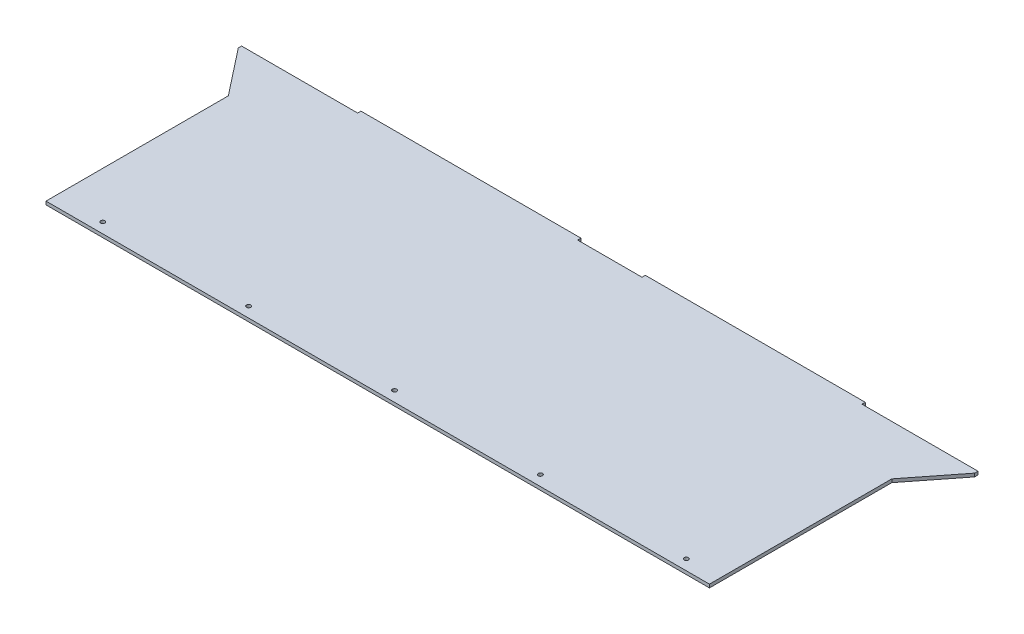
ISO-10303-21;
HEADER;
FILE_DESCRIPTION(('STEP AP214'),'2;1');
FILE_NAME('part.step','',(''),(''),'','','');
FILE_SCHEMA(('AUTOMOTIVE_DESIGN { 1 0 10303 214 1 1 1 1 }'));
ENDSEC;
DATA;
#1=APPLICATION_CONTEXT('core data for automotive mechanical design processes');
#2=APPLICATION_PROTOCOL_DEFINITION('international standard','automotive_design',2000,#1);
#3=PRODUCT_CONTEXT('',#1,'mechanical');
#4=PRODUCT('Part','Part','',(#3));
#5=PRODUCT_RELATED_PRODUCT_CATEGORY('part','',(#4));
#6=PRODUCT_DEFINITION_FORMATION('','',#4);
#7=PRODUCT_DEFINITION_CONTEXT('part definition',#1,'design');
#8=PRODUCT_DEFINITION('design','',#6,#7);
#9=PRODUCT_DEFINITION_SHAPE('','',#8);
#10=(LENGTH_UNIT() NAMED_UNIT(*) SI_UNIT(.MILLI.,.METRE.));
#11=(NAMED_UNIT(*) PLANE_ANGLE_UNIT() SI_UNIT($,.RADIAN.));
#12=(NAMED_UNIT(*) SI_UNIT($,.STERADIAN.) SOLID_ANGLE_UNIT());
#13=UNCERTAINTY_MEASURE_WITH_UNIT(LENGTH_MEASURE(1.E-05),#10,'distance_accuracy_value','');
#14=(GEOMETRIC_REPRESENTATION_CONTEXT(3) GLOBAL_UNCERTAINTY_ASSIGNED_CONTEXT((#13)) GLOBAL_UNIT_ASSIGNED_CONTEXT((#10,
#11,#12)) REPRESENTATION_CONTEXT('',''));
#15=CARTESIAN_POINT('',(0.,0.,0.));
#16=DIRECTION('',(0.,0.,1.));
#17=DIRECTION('',(1.,0.,0.));
#18=AXIS2_PLACEMENT_3D('',#15,#16,#17);
#19=CARTESIAN_POINT('',(285.5722,-8.4125,101.219));
#20=DIRECTION('',(0.,1.,0.));
#21=DIRECTION('',(0.,0.,1.));
#22=AXIS2_PLACEMENT_3D('',#19,#20,#21);
#23=CYLINDRICAL_SURFACE('',#22,2.02500000000001);
#24=CARTESIAN_POINT('',(285.5722,1.5875,101.219));
#25=DIRECTION('',(0.,1.,0.));
#26=DIRECTION('',(0.,0.,1.));
#27=AXIS2_PLACEMENT_3D('',#24,#25,#26);
#28=CIRCLE('',#27,2.02500000000001);
#29=CARTESIAN_POINT('',(285.5722,1.5875,103.244));
#30=VERTEX_POINT('',#29);
#31=EDGE_CURVE('E49',#30,#30,#28,.T.);
#32=ORIENTED_EDGE('',*,*,#31,.T.);
#33=EDGE_LOOP('',(#32));
#34=FACE_BOUND('',#33,.T.);
#35=CARTESIAN_POINT('',(285.5722,-1.5875,101.219));
#36=DIRECTION('',(0.,1.,0.));
#37=DIRECTION('',(0.,0.,1.));
#38=AXIS2_PLACEMENT_3D('',#35,#36,#37);
#39=CIRCLE('',#38,2.02500000000001);
#40=CARTESIAN_POINT('',(285.5722,-1.5875,103.244));
#41=VERTEX_POINT('',#40);
#42=EDGE_CURVE('E11',#41,#41,#39,.T.);
#43=ORIENTED_EDGE('',*,*,#42,.F.);
#44=EDGE_LOOP('',(#43));
#45=FACE_BOUND('',#44,.T.);
#46=ADVANCED_FACE('F41',(#34,#45),#23,.F.);
#47=CARTESIAN_POINT('',(145.8722,-8.4125,101.219));
#48=DIRECTION('',(0.,1.,0.));
#49=DIRECTION('',(0.,0.,1.));
#50=AXIS2_PLACEMENT_3D('',#47,#48,#49);
#51=CYLINDRICAL_SURFACE('',#50,2.02500000000001);
#52=CARTESIAN_POINT('',(145.8722,1.5875,101.219));
#53=DIRECTION('',(0.,1.,0.));
#54=DIRECTION('',(0.,0.,1.));
#55=AXIS2_PLACEMENT_3D('',#52,#53,#54);
#56=CIRCLE('',#55,2.02500000000001);
#57=CARTESIAN_POINT('',(145.8722,1.5875,103.244));
#58=VERTEX_POINT('',#57);
#59=EDGE_CURVE('E340',#58,#58,#56,.T.);
#60=ORIENTED_EDGE('',*,*,#59,.T.);
#61=EDGE_LOOP('',(#60));
#62=FACE_BOUND('',#61,.T.);
#63=CARTESIAN_POINT('',(145.8722,-1.5875,101.219));
#64=DIRECTION('',(0.,1.,0.));
#65=DIRECTION('',(0.,0.,1.));
#66=AXIS2_PLACEMENT_3D('',#63,#64,#65);
#67=CIRCLE('',#66,2.02500000000001);
#68=CARTESIAN_POINT('',(145.8722,-1.5875,103.244));
#69=VERTEX_POINT('',#68);
#70=EDGE_CURVE('E344',#69,#69,#67,.T.);
#71=ORIENTED_EDGE('',*,*,#70,.F.);
#72=EDGE_LOOP('',(#71));
#73=FACE_BOUND('',#72,.T.);
#74=ADVANCED_FACE('F371',(#62,#73),#51,.F.);
#75=CARTESIAN_POINT('',(6.17219999999996,-8.4125,101.219));
#76=DIRECTION('',(0.,1.,0.));
#77=DIRECTION('',(0.,0.,1.));
#78=AXIS2_PLACEMENT_3D('',#75,#76,#77);
#79=CYLINDRICAL_SURFACE('',#78,2.02500000000001);
#80=CARTESIAN_POINT('',(6.17219999999996,1.5875,101.219));
#81=DIRECTION('',(0.,1.,0.));
#82=DIRECTION('',(0.,0.,1.));
#83=AXIS2_PLACEMENT_3D('',#80,#81,#82);
#84=CIRCLE('',#83,2.02500000000001);
#85=CARTESIAN_POINT('',(6.17219999999996,1.5875,103.244));
#86=VERTEX_POINT('',#85);
#87=EDGE_CURVE('E329',#86,#86,#84,.T.);
#88=ORIENTED_EDGE('',*,*,#87,.T.);
#89=EDGE_LOOP('',(#88));
#90=FACE_BOUND('',#89,.T.);
#91=CARTESIAN_POINT('',(6.17219999999996,-1.5875,101.219));
#92=DIRECTION('',(0.,1.,0.));
#93=DIRECTION('',(0.,0.,1.));
#94=AXIS2_PLACEMENT_3D('',#91,#92,#93);
#95=CIRCLE('',#94,2.02500000000001);
#96=CARTESIAN_POINT('',(6.17219999999996,-1.5875,103.244));
#97=VERTEX_POINT('',#96);
#98=EDGE_CURVE('E336',#97,#97,#95,.T.);
#99=ORIENTED_EDGE('',*,*,#98,.F.);
#100=EDGE_LOOP('',(#99));
#101=FACE_BOUND('',#100,.T.);
#102=ADVANCED_FACE('F375',(#90,#101),#79,.F.);
#103=CARTESIAN_POINT('',(-317.6778,1.5875,-111.125));
#104=DIRECTION('',(1.,0.,0.));
#105=DIRECTION('',(0.,0.,-1.));
#106=AXIS2_PLACEMENT_3D('',#103,#104,#105);
#107=PLANE('',#106);
#108=DIRECTION('',(0.,1.,0.));
#109=VECTOR('',#108,1.);
#110=CARTESIAN_POINT('',(-317.6778,-1.5875,-63.5));
#111=LINE('',#110,#109);
#112=CARTESIAN_POINT('',(-317.6778,-1.5875,-63.5));
#113=VERTEX_POINT('',#112);
#114=CARTESIAN_POINT('',(-317.6778,1.5875,-63.5));
#115=VERTEX_POINT('',#114);
#116=EDGE_CURVE('E64',#113,#115,#111,.T.);
#117=ORIENTED_EDGE('',*,*,#116,.F.);
#118=DIRECTION('',(0.,0.,1.));
#119=VECTOR('',#118,1.);
#120=CARTESIAN_POINT('',(-317.6778,-1.5875,-111.125));
#121=LINE('',#120,#119);
#122=CARTESIAN_POINT('',(-317.6778,-1.5875,111.125));
#123=VERTEX_POINT('',#122);
#124=EDGE_CURVE('E169',#113,#123,#121,.T.);
#125=ORIENTED_EDGE('',*,*,#124,.T.);
#126=DIRECTION('',(0.,-1.,0.));
#127=VECTOR('',#126,1.);
#128=CARTESIAN_POINT('',(-317.6778,1.5875,111.125));
#129=LINE('',#128,#127);
#130=CARTESIAN_POINT('',(-317.6778,1.5875,111.125));
#131=VERTEX_POINT('',#130);
#132=EDGE_CURVE('E325',#131,#123,#129,.T.);
#133=ORIENTED_EDGE('',*,*,#132,.F.);
#134=DIRECTION('',(0.,0.,1.));
#135=VECTOR('',#134,1.);
#136=CARTESIAN_POINT('',(-317.6778,1.5875,-111.125));
#137=LINE('',#136,#135);
#138=EDGE_CURVE('E307',#115,#131,#137,.T.);
#139=ORIENTED_EDGE('',*,*,#138,.F.);
#140=EDGE_LOOP('',(#117,#125,#133,#139));
#141=FACE_BOUND('',#140,.T.);
#142=ADVANCED_FACE('F380',(#141),#107,.F.);
#143=CARTESIAN_POINT('',(-317.6778,1.5875,-111.125));
#144=DIRECTION('',(0.,0.,1.));
#145=DIRECTION('',(1.,0.,0.));
#146=AXIS2_PLACEMENT_3D('',#143,#144,#145);
#147=PLANE('',#146);
#148=DIRECTION('',(0.,1.,0.));
#149=VECTOR('',#148,1.);
#150=CARTESIAN_POINT('',(-241.4778,0.,-111.125));
#151=LINE('',#150,#149);
#152=CARTESIAN_POINT('',(-241.4778,-1.5875,-111.125));
#153=VERTEX_POINT('',#152);
#154=CARTESIAN_POINT('',(-241.4778,1.5875,-111.125));
#155=VERTEX_POINT('',#154);
#156=EDGE_CURVE('E236',#153,#155,#151,.T.);
#157=ORIENTED_EDGE('',*,*,#156,.F.);
#158=DIRECTION('',(-1.,0.,0.));
#159=VECTOR('',#158,1.);
#160=CARTESIAN_POINT('',(-317.6778,-1.5875,-111.125));
#161=LINE('',#160,#159);
#162=CARTESIAN_POINT('',(-352.6028,-1.5875,-111.125));
#163=VERTEX_POINT('',#162);
#164=EDGE_CURVE('E172',#153,#163,#161,.T.);
#165=ORIENTED_EDGE('',*,*,#164,.T.);
#166=DIRECTION('',(0.,1.,0.));
#167=VECTOR('',#166,1.);
#168=CARTESIAN_POINT('',(-352.6028,-1.5875,-111.125));
#169=LINE('',#168,#167);
#170=CARTESIAN_POINT('',(-352.6028,1.5875,-111.125));
#171=VERTEX_POINT('',#170);
#172=EDGE_CURVE('E222',#163,#171,#169,.T.);
#173=ORIENTED_EDGE('',*,*,#172,.T.);
#174=DIRECTION('',(-1.,0.,0.));
#175=VECTOR('',#174,1.);
#176=CARTESIAN_POINT('',(-317.6778,1.5875,-111.125));
#177=LINE('',#176,#175);
#178=EDGE_CURVE('E303',#155,#171,#177,.T.);
#179=ORIENTED_EDGE('',*,*,#178,.F.);
#180=EDGE_LOOP('',(#157,#165,#173,#179));
#181=FACE_BOUND('',#180,.T.);
#182=ADVANCED_FACE('F392',(#181),#147,.F.);
#183=CARTESIAN_POINT('',(30.8229000000015,-1.5875,-111.125));
#184=VERTEX_POINT('',#183);
#185=CARTESIAN_POINT('',(-30.8229000000015,-1.5875,-111.125));
#186=VERTEX_POINT('',#185);
#187=EDGE_CURVE('E170',#184,#186,#161,.T.);
#188=ORIENTED_EDGE('',*,*,#187,.T.);
#189=DIRECTION('',(0.,1.,0.));
#190=VECTOR('',#189,1.);
#191=CARTESIAN_POINT('',(-30.8229000000015,0.,-111.125));
#192=LINE('',#191,#190);
#193=CARTESIAN_POINT('',(-30.8229000000015,1.5875,-111.125));
#194=VERTEX_POINT('',#193);
#195=EDGE_CURVE('E226',#186,#194,#192,.T.);
#196=ORIENTED_EDGE('',*,*,#195,.T.);
#197=CARTESIAN_POINT('',(30.8229000000015,1.5875,-111.125));
#198=VERTEX_POINT('',#197);
#199=EDGE_CURVE('E308',#198,#194,#177,.T.);
#200=ORIENTED_EDGE('',*,*,#199,.F.);
#201=DIRECTION('',(0.,-1.,0.));
#202=VECTOR('',#201,1.);
#203=CARTESIAN_POINT('',(30.8229000000015,0.,-111.125));
#204=LINE('',#203,#202);
#205=EDGE_CURVE('E266',#198,#184,#204,.T.);
#206=ORIENTED_EDGE('',*,*,#205,.T.);
#207=EDGE_LOOP('',(#188,#196,#200,#206));
#208=FACE_BOUND('',#207,.T.);
#209=ADVANCED_FACE('F388',(#208),#147,.F.);
#210=CARTESIAN_POINT('',(317.6778,1.5875,-111.125));
#211=DIRECTION('',(-1.,0.,0.));
#212=DIRECTION('',(0.,0.,1.));
#213=AXIS2_PLACEMENT_3D('',#210,#211,#212);
#214=PLANE('',#213);
#215=DIRECTION('',(0.,0.,-1.));
#216=VECTOR('',#215,1.);
#217=CARTESIAN_POINT('',(317.6778,-1.5875,-111.125));
#218=LINE('',#217,#216);
#219=CARTESIAN_POINT('',(317.6778,-1.5875,111.125));
#220=VERTEX_POINT('',#219);
#221=CARTESIAN_POINT('',(317.6778,-1.5875,-63.5));
#222=VERTEX_POINT('',#221);
#223=EDGE_CURVE('E298',#220,#222,#218,.T.);
#224=ORIENTED_EDGE('',*,*,#223,.T.);
#225=DIRECTION('',(0.,1.,0.));
#226=VECTOR('',#225,1.);
#227=CARTESIAN_POINT('',(317.6778,-1.5875,-63.5));
#228=LINE('',#227,#226);
#229=CARTESIAN_POINT('',(317.6778,1.5875,-63.5));
#230=VERTEX_POINT('',#229);
#231=EDGE_CURVE('E182',#222,#230,#228,.T.);
#232=ORIENTED_EDGE('',*,*,#231,.T.);
#233=DIRECTION('',(0.,0.,-1.));
#234=VECTOR('',#233,1.);
#235=CARTESIAN_POINT('',(317.6778,1.5875,-111.125));
#236=LINE('',#235,#234);
#237=CARTESIAN_POINT('',(317.6778,1.5875,111.125));
#238=VERTEX_POINT('',#237);
#239=EDGE_CURVE('E299',#238,#230,#236,.T.);
#240=ORIENTED_EDGE('',*,*,#239,.F.);
#241=DIRECTION('',(0.,-1.,0.));
#242=VECTOR('',#241,1.);
#243=CARTESIAN_POINT('',(317.6778,1.5875,111.125));
#244=LINE('',#243,#242);
#245=EDGE_CURVE('E314',#238,#220,#244,.T.);
#246=ORIENTED_EDGE('',*,*,#245,.T.);
#247=EDGE_LOOP('',(#224,#232,#240,#246));
#248=FACE_BOUND('',#247,.T.);
#249=ADVANCED_FACE('F385',(#248),#214,.F.);
#250=CARTESIAN_POINT('',(352.6028,-1.5875,-111.125));
#251=VERTEX_POINT('',#250);
#252=CARTESIAN_POINT('',(241.4778,-1.5875,-111.125));
#253=VERTEX_POINT('',#252);
#254=EDGE_CURVE('E155',#251,#253,#161,.T.);
#255=ORIENTED_EDGE('',*,*,#254,.T.);
#256=DIRECTION('',(0.,1.,0.));
#257=VECTOR('',#256,1.);
#258=CARTESIAN_POINT('',(241.4778,2.1109780590225E-11,-111.125));
#259=LINE('',#258,#257);
#260=CARTESIAN_POINT('',(241.4778,1.5875,-111.125));
#261=VERTEX_POINT('',#260);
#262=EDGE_CURVE('E272',#253,#261,#259,.T.);
#263=ORIENTED_EDGE('',*,*,#262,.T.);
#264=CARTESIAN_POINT('',(352.6028,1.5875,-111.125));
#265=VERTEX_POINT('',#264);
#266=EDGE_CURVE('E177',#265,#261,#177,.T.);
#267=ORIENTED_EDGE('',*,*,#266,.F.);
#268=DIRECTION('',(0.,1.,0.));
#269=VECTOR('',#268,1.);
#270=CARTESIAN_POINT('',(352.6028,-1.5875,-111.125));
#271=LINE('',#270,#269);
#272=EDGE_CURVE('E174',#251,#265,#271,.T.);
#273=ORIENTED_EDGE('',*,*,#272,.F.);
#274=EDGE_LOOP('',(#255,#263,#267,#273));
#275=FACE_BOUND('',#274,.T.);
#276=ADVANCED_FACE('F175',(#275),#147,.F.);
#277=CARTESIAN_POINT('',(-317.6778,1.5875,111.125));
#278=DIRECTION('',(0.,0.,-1.));
#279=DIRECTION('',(-1.,0.,0.));
#280=AXIS2_PLACEMENT_3D('',#277,#278,#279);
#281=PLANE('',#280);
#282=DIRECTION('',(1.,0.,0.));
#283=VECTOR('',#282,1.);
#284=CARTESIAN_POINT('',(-317.6778,-1.5875,111.125));
#285=LINE('',#284,#283);
#286=EDGE_CURVE('E304',#123,#220,#285,.T.);
#287=ORIENTED_EDGE('',*,*,#286,.T.);
#288=ORIENTED_EDGE('',*,*,#245,.F.);
#289=DIRECTION('',(1.,0.,0.));
#290=VECTOR('',#289,1.);
#291=CARTESIAN_POINT('',(-317.6778,1.5875,111.125));
#292=LINE('',#291,#290);
#293=EDGE_CURVE('E311',#131,#238,#292,.T.);
#294=ORIENTED_EDGE('',*,*,#293,.F.);
#295=ORIENTED_EDGE('',*,*,#132,.T.);
#296=EDGE_LOOP('',(#287,#288,#294,#295));
#297=FACE_BOUND('',#296,.T.);
#298=ADVANCED_FACE('F355',(#297),#281,.F.);
#299=CARTESIAN_POINT('',(0.,1.5875,0.));
#300=DIRECTION('',(0.,1.,0.));
#301=DIRECTION('',(0.,0.,1.));
#302=AXIS2_PLACEMENT_3D('',#299,#300,#301);
#303=PLANE('',#302);
#304=CARTESIAN_POINT('',(-133.5278,1.5875,101.219));
#305=DIRECTION('',(0.,1.,0.));
#306=DIRECTION('',(0.,0.,1.));
#307=AXIS2_PLACEMENT_3D('',#304,#305,#306);
#308=CIRCLE('',#307,2.02500000000001);
#309=CARTESIAN_POINT('',(-133.5278,1.5875,103.244));
#310=VERTEX_POINT('',#309);
#311=EDGE_CURVE('E568',#310,#310,#308,.T.);
#312=ORIENTED_EDGE('',*,*,#311,.F.);
#313=EDGE_LOOP('',(#312));
#314=FACE_BOUND('',#313,.T.);
#315=CARTESIAN_POINT('',(-273.2278,1.5875,101.219));
#316=DIRECTION('',(0.,1.,0.));
#317=DIRECTION('',(0.,0.,1.));
#318=AXIS2_PLACEMENT_3D('',#315,#316,#317);
#319=CIRCLE('',#318,2.02500000000001);
#320=CARTESIAN_POINT('',(-273.2278,1.5875,103.244));
#321=VERTEX_POINT('',#320);
#322=EDGE_CURVE('E195',#321,#321,#319,.T.);
#323=ORIENTED_EDGE('',*,*,#322,.F.);
#324=EDGE_LOOP('',(#323));
#325=FACE_BOUND('',#324,.T.);
#326=ORIENTED_EDGE('',*,*,#239,.T.);
#327=DIRECTION('',(-0.617821551931903,0.,0.786318338822423));
#328=VECTOR('',#327,1.);
#329=CARTESIAN_POINT('',(165.570500946372,1.5875,130.091107886435));
#330=LINE('',#329,#328);
#331=CARTESIAN_POINT('',(352.6028,1.5875,-107.95));
#332=VERTEX_POINT('',#331);
#333=EDGE_CURVE('E56',#332,#230,#330,.T.);
#334=ORIENTED_EDGE('',*,*,#333,.F.);
#335=DIRECTION('',(0.,0.,1.));
#336=VECTOR('',#335,1.);
#337=CARTESIAN_POINT('',(352.6028,1.5875,0.));
#338=LINE('',#337,#336);
#339=EDGE_CURVE('E192',#265,#332,#338,.T.);
#340=ORIENTED_EDGE('',*,*,#339,.F.);
#341=ORIENTED_EDGE('',*,*,#266,.T.);
#342=DIRECTION('',(0.,0.,1.));
#343=VECTOR('',#342,1.);
#344=CARTESIAN_POINT('',(241.4778,1.5875,-114.3));
#345=LINE('',#344,#343);
#346=CARTESIAN_POINT('',(241.4778,1.5875,-114.3));
#347=VERTEX_POINT('',#346);
#348=EDGE_CURVE('E292',#347,#261,#345,.T.);
#349=ORIENTED_EDGE('',*,*,#348,.F.);
#350=DIRECTION('',(1.,0.,0.));
#351=VECTOR('',#350,1.);
#352=CARTESIAN_POINT('',(0.,1.5875,-114.3));
#353=LINE('',#352,#351);
#354=CARTESIAN_POINT('',(30.8229000000015,1.5875,-114.3));
#355=VERTEX_POINT('',#354);
#356=EDGE_CURVE('E271',#355,#347,#353,.T.);
#357=ORIENTED_EDGE('',*,*,#356,.F.);
#358=DIRECTION('',(0.,0.,1.));
#359=VECTOR('',#358,1.);
#360=CARTESIAN_POINT('',(30.8229000000015,1.5875,-114.3));
#361=LINE('',#360,#359);
#362=EDGE_CURVE('E295',#355,#198,#361,.T.);
#363=ORIENTED_EDGE('',*,*,#362,.T.);
#364=ORIENTED_EDGE('',*,*,#199,.T.);
#365=DIRECTION('',(0.,0.,1.));
#366=VECTOR('',#365,1.);
#367=CARTESIAN_POINT('',(-30.8229000000015,1.5875,-114.3));
#368=LINE('',#367,#366);
#369=CARTESIAN_POINT('',(-30.8229000000015,1.5875,-114.3));
#370=VERTEX_POINT('',#369);
#371=EDGE_CURVE('E245',#370,#194,#368,.T.);
#372=ORIENTED_EDGE('',*,*,#371,.F.);
#373=DIRECTION('',(1.,0.,0.));
#374=VECTOR('',#373,1.);
#375=CARTESIAN_POINT('',(0.,1.5875,-114.3));
#376=LINE('',#375,#374);
#377=CARTESIAN_POINT('',(-241.4778,1.5875,-114.3));
#378=VERTEX_POINT('',#377);
#379=EDGE_CURVE('E242',#378,#370,#376,.T.);
#380=ORIENTED_EDGE('',*,*,#379,.F.);
#381=DIRECTION('',(0.,0.,1.));
#382=VECTOR('',#381,1.);
#383=CARTESIAN_POINT('',(-241.4778,1.5875,-114.3));
#384=LINE('',#383,#382);
#385=EDGE_CURVE('E254',#378,#155,#384,.T.);
#386=ORIENTED_EDGE('',*,*,#385,.T.);
#387=ORIENTED_EDGE('',*,*,#178,.T.);
#388=DIRECTION('',(0.,0.,1.));
#389=VECTOR('',#388,1.);
#390=CARTESIAN_POINT('',(-352.6028,1.5875,0.));
#391=LINE('',#390,#389);
#392=CARTESIAN_POINT('',(-352.6028,1.5875,-107.95));
#393=VERTEX_POINT('',#392);
#394=EDGE_CURVE('E203',#171,#393,#391,.T.);
#395=ORIENTED_EDGE('',*,*,#394,.T.);
#396=DIRECTION('',(0.617821551931903,0.,0.786318338822423));
#397=VECTOR('',#396,1.);
#398=CARTESIAN_POINT('',(-165.570500946372,1.5875,130.091107886435));
#399=LINE('',#398,#397);
#400=EDGE_CURVE('E211',#393,#115,#399,.T.);
#401=ORIENTED_EDGE('',*,*,#400,.T.);
#402=ORIENTED_EDGE('',*,*,#138,.T.);
#403=ORIENTED_EDGE('',*,*,#293,.T.);
#404=EDGE_LOOP('',(#326,#334,#340,#341,#349,#357,#363,#364,#372,#380,#386,#387,#395,#401,#402,#403));
#405=FACE_BOUND('',#404,.T.);
#406=ORIENTED_EDGE('',*,*,#87,.F.);
#407=EDGE_LOOP('',(#406));
#408=FACE_BOUND('',#407,.T.);
#409=ORIENTED_EDGE('',*,*,#59,.F.);
#410=EDGE_LOOP('',(#409));
#411=FACE_BOUND('',#410,.T.);
#412=ORIENTED_EDGE('',*,*,#31,.F.);
#413=EDGE_LOOP('',(#412));
#414=FACE_BOUND('',#413,.T.);
#415=ADVANCED_FACE('F353',(#314,#325,#405,#408,#411,#414),#303,.T.);
#416=CARTESIAN_POINT('',(0.,-1.5875,0.));
#417=DIRECTION('',(0.,1.,0.));
#418=DIRECTION('',(0.,0.,1.));
#419=AXIS2_PLACEMENT_3D('',#416,#417,#418);
#420=PLANE('',#419);
#421=CARTESIAN_POINT('',(-133.5278,-1.5875,101.219));
#422=DIRECTION('',(0.,1.,0.));
#423=DIRECTION('',(0.,0.,1.));
#424=AXIS2_PLACEMENT_3D('',#421,#422,#423);
#425=CIRCLE('',#424,2.02500000000001);
#426=CARTESIAN_POINT('',(-133.5278,-1.5875,103.244));
#427=VERTEX_POINT('',#426);
#428=EDGE_CURVE('E571',#427,#427,#425,.T.);
#429=ORIENTED_EDGE('',*,*,#428,.T.);
#430=EDGE_LOOP('',(#429));
#431=FACE_BOUND('',#430,.T.);
#432=CARTESIAN_POINT('',(-273.2278,-1.5875,101.219));
#433=DIRECTION('',(0.,1.,0.));
#434=DIRECTION('',(0.,0.,1.));
#435=AXIS2_PLACEMENT_3D('',#432,#433,#434);
#436=CIRCLE('',#435,2.02500000000001);
#437=CARTESIAN_POINT('',(-273.2278,-1.5875,103.244));
#438=VERTEX_POINT('',#437);
#439=EDGE_CURVE('E199',#438,#438,#436,.T.);
#440=ORIENTED_EDGE('',*,*,#439,.T.);
#441=EDGE_LOOP('',(#440));
#442=FACE_BOUND('',#441,.T.);
#443=ORIENTED_EDGE('',*,*,#223,.F.);
#444=ORIENTED_EDGE('',*,*,#286,.F.);
#445=ORIENTED_EDGE('',*,*,#124,.F.);
#446=DIRECTION('',(0.617821551931903,0.,0.786318338822423));
#447=VECTOR('',#446,1.);
#448=CARTESIAN_POINT('',(-165.570500946372,-1.5875,130.091107886435));
#449=LINE('',#448,#447);
#450=CARTESIAN_POINT('',(-352.6028,-1.5875,-107.95));
#451=VERTEX_POINT('',#450);
#452=EDGE_CURVE('E210',#451,#113,#449,.T.);
#453=ORIENTED_EDGE('',*,*,#452,.F.);
#454=DIRECTION('',(0.,0.,1.));
#455=VECTOR('',#454,1.);
#456=CARTESIAN_POINT('',(-352.6028,-1.5875,0.));
#457=LINE('',#456,#455);
#458=EDGE_CURVE('E206',#163,#451,#457,.T.);
#459=ORIENTED_EDGE('',*,*,#458,.F.);
#460=ORIENTED_EDGE('',*,*,#164,.F.);
#461=DIRECTION('',(0.,0.,1.));
#462=VECTOR('',#461,1.);
#463=CARTESIAN_POINT('',(-241.4778,-1.5875,-114.3));
#464=LINE('',#463,#462);
#465=CARTESIAN_POINT('',(-241.4778,-1.5875,-114.3));
#466=VERTEX_POINT('',#465);
#467=EDGE_CURVE('E258',#466,#153,#464,.T.);
#468=ORIENTED_EDGE('',*,*,#467,.F.);
#469=DIRECTION('',(-1.,0.,0.));
#470=VECTOR('',#469,1.);
#471=CARTESIAN_POINT('',(0.,-1.5875,-114.3));
#472=LINE('',#471,#470);
#473=CARTESIAN_POINT('',(-30.8229000000015,-1.5875,-114.3));
#474=VERTEX_POINT('',#473);
#475=EDGE_CURVE('E235',#474,#466,#472,.T.);
#476=ORIENTED_EDGE('',*,*,#475,.F.);
#477=DIRECTION('',(0.,0.,1.));
#478=VECTOR('',#477,1.);
#479=CARTESIAN_POINT('',(-30.8229000000015,-1.5875,-114.3));
#480=LINE('',#479,#478);
#481=EDGE_CURVE('E262',#474,#186,#480,.T.);
#482=ORIENTED_EDGE('',*,*,#481,.T.);
#483=ORIENTED_EDGE('',*,*,#187,.F.);
#484=DIRECTION('',(0.,0.,1.));
#485=VECTOR('',#484,1.);
#486=CARTESIAN_POINT('',(30.8229000000015,-1.5875,-114.3));
#487=LINE('',#486,#485);
#488=CARTESIAN_POINT('',(30.8229000000015,-1.5875,-114.3));
#489=VERTEX_POINT('',#488);
#490=EDGE_CURVE('E282',#489,#184,#487,.T.);
#491=ORIENTED_EDGE('',*,*,#490,.F.);
#492=DIRECTION('',(-1.,0.,0.));
#493=VECTOR('',#492,1.);
#494=CARTESIAN_POINT('',(0.,-1.5875,-114.3));
#495=LINE('',#494,#493);
#496=CARTESIAN_POINT('',(241.4778,-1.5875,-114.3));
#497=VERTEX_POINT('',#496);
#498=EDGE_CURVE('E279',#497,#489,#495,.T.);
#499=ORIENTED_EDGE('',*,*,#498,.F.);
#500=DIRECTION('',(0.,0.,1.));
#501=VECTOR('',#500,1.);
#502=CARTESIAN_POINT('',(241.4778,-1.5875,-114.3));
#503=LINE('',#502,#501);
#504=EDGE_CURVE('E164',#497,#253,#503,.T.);
#505=ORIENTED_EDGE('',*,*,#504,.T.);
#506=ORIENTED_EDGE('',*,*,#254,.F.);
#507=DIRECTION('',(0.,0.,1.));
#508=VECTOR('',#507,1.);
#509=CARTESIAN_POINT('',(352.6028,-1.5875,0.));
#510=LINE('',#509,#508);
#511=CARTESIAN_POINT('',(352.6028,-1.5875,-107.95));
#512=VERTEX_POINT('',#511);
#513=EDGE_CURVE('E161',#251,#512,#510,.T.);
#514=ORIENTED_EDGE('',*,*,#513,.T.);
#515=DIRECTION('',(-0.617821551931903,0.,0.786318338822423));
#516=VECTOR('',#515,1.);
#517=CARTESIAN_POINT('',(165.570500946372,-1.5875,130.091107886435));
#518=LINE('',#517,#516);
#519=EDGE_CURVE('E183',#512,#222,#518,.T.);
#520=ORIENTED_EDGE('',*,*,#519,.T.);
#521=EDGE_LOOP('',(#443,#444,#445,#453,#459,#460,#468,#476,#482,#483,#491,#499,#505,#506,#514,#520));
#522=FACE_BOUND('',#521,.T.);
#523=ORIENTED_EDGE('',*,*,#98,.T.);
#524=EDGE_LOOP('',(#523));
#525=FACE_BOUND('',#524,.T.);
#526=ORIENTED_EDGE('',*,*,#70,.T.);
#527=EDGE_LOOP('',(#526));
#528=FACE_BOUND('',#527,.T.);
#529=ORIENTED_EDGE('',*,*,#42,.T.);
#530=EDGE_LOOP('',(#529));
#531=FACE_BOUND('',#530,.T.);
#532=ADVANCED_FACE('F158',(#431,#442,#522,#525,#528,#531),#420,.F.);
#533=CARTESIAN_POINT('',(30.8229000000015,0.,-114.3));
#534=DIRECTION('',(-1.,0.,0.));
#535=DIRECTION('',(0.,-1.,0.));
#536=AXIS2_PLACEMENT_3D('',#533,#534,#535);
#537=PLANE('',#536);
#538=ORIENTED_EDGE('',*,*,#205,.F.);
#539=ORIENTED_EDGE('',*,*,#362,.F.);
#540=DIRECTION('',(0.,-1.,0.));
#541=VECTOR('',#540,1.);
#542=CARTESIAN_POINT('',(30.8229000000015,0.,-114.3));
#543=LINE('',#542,#541);
#544=EDGE_CURVE('E267',#355,#489,#543,.T.);
#545=ORIENTED_EDGE('',*,*,#544,.T.);
#546=ORIENTED_EDGE('',*,*,#490,.T.);
#547=EDGE_LOOP('',(#538,#539,#545,#546));
#548=FACE_BOUND('',#547,.T.);
#549=ADVANCED_FACE('F362',(#548),#537,.T.);
#550=CARTESIAN_POINT('',(241.4778,2.1109780590225E-11,-114.3));
#551=DIRECTION('',(1.,0.,0.));
#552=DIRECTION('',(0.,1.,0.));
#553=AXIS2_PLACEMENT_3D('',#550,#551,#552);
#554=PLANE('',#553);
#555=ORIENTED_EDGE('',*,*,#262,.F.);
#556=ORIENTED_EDGE('',*,*,#504,.F.);
#557=DIRECTION('',(0.,1.,0.));
#558=VECTOR('',#557,1.);
#559=CARTESIAN_POINT('',(241.4778,2.1109780590225E-11,-114.3));
#560=LINE('',#559,#558);
#561=EDGE_CURVE('E275',#497,#347,#560,.T.);
#562=ORIENTED_EDGE('',*,*,#561,.T.);
#563=ORIENTED_EDGE('',*,*,#348,.T.);
#564=EDGE_LOOP('',(#555,#556,#562,#563));
#565=FACE_BOUND('',#564,.T.);
#566=ADVANCED_FACE('F470',(#565),#554,.T.);
#567=CARTESIAN_POINT('',(0.,0.,-114.3));
#568=DIRECTION('',(0.,0.,-1.));
#569=DIRECTION('',(-1.,0.,0.));
#570=AXIS2_PLACEMENT_3D('',#567,#568,#569);
#571=PLANE('',#570);
#572=ORIENTED_EDGE('',*,*,#544,.F.);
#573=ORIENTED_EDGE('',*,*,#356,.T.);
#574=ORIENTED_EDGE('',*,*,#561,.F.);
#575=ORIENTED_EDGE('',*,*,#498,.T.);
#576=EDGE_LOOP('',(#572,#573,#574,#575));
#577=FACE_BOUND('',#576,.T.);
#578=ADVANCED_FACE('F467',(#577),#571,.T.);
#579=CARTESIAN_POINT('',(-30.8229000000015,0.,-114.3));
#580=DIRECTION('',(1.,0.,0.));
#581=DIRECTION('',(0.,0.,-1.));
#582=AXIS2_PLACEMENT_3D('',#579,#580,#581);
#583=PLANE('',#582);
#584=ORIENTED_EDGE('',*,*,#195,.F.);
#585=ORIENTED_EDGE('',*,*,#481,.F.);
#586=DIRECTION('',(0.,1.,0.));
#587=VECTOR('',#586,1.);
#588=CARTESIAN_POINT('',(-30.8229000000015,0.,-114.3));
#589=LINE('',#588,#587);
#590=EDGE_CURVE('E231',#474,#370,#589,.T.);
#591=ORIENTED_EDGE('',*,*,#590,.T.);
#592=ORIENTED_EDGE('',*,*,#371,.T.);
#593=EDGE_LOOP('',(#584,#585,#591,#592));
#594=FACE_BOUND('',#593,.T.);
#595=ADVANCED_FACE('F422',(#594),#583,.T.);
#596=CARTESIAN_POINT('',(-241.4778,0.,-114.3));
#597=DIRECTION('',(1.,0.,0.));
#598=DIRECTION('',(0.,0.,-1.));
#599=AXIS2_PLACEMENT_3D('',#596,#597,#598);
#600=PLANE('',#599);
#601=ORIENTED_EDGE('',*,*,#156,.T.);
#602=ORIENTED_EDGE('',*,*,#385,.F.);
#603=DIRECTION('',(0.,1.,0.));
#604=VECTOR('',#603,1.);
#605=CARTESIAN_POINT('',(-241.4778,0.,-114.3));
#606=LINE('',#605,#604);
#607=EDGE_CURVE('E239',#466,#378,#606,.T.);
#608=ORIENTED_EDGE('',*,*,#607,.F.);
#609=ORIENTED_EDGE('',*,*,#467,.T.);
#610=EDGE_LOOP('',(#601,#602,#608,#609));
#611=FACE_BOUND('',#610,.T.);
#612=ADVANCED_FACE('F408',(#611),#600,.F.);
#613=CARTESIAN_POINT('',(0.,0.,-114.3));
#614=DIRECTION('',(0.,0.,-1.));
#615=DIRECTION('',(-1.,0.,0.));
#616=AXIS2_PLACEMENT_3D('',#613,#614,#615);
#617=PLANE('',#616);
#618=ORIENTED_EDGE('',*,*,#590,.F.);
#619=ORIENTED_EDGE('',*,*,#475,.T.);
#620=ORIENTED_EDGE('',*,*,#607,.T.);
#621=ORIENTED_EDGE('',*,*,#379,.T.);
#622=EDGE_LOOP('',(#618,#619,#620,#621));
#623=FACE_BOUND('',#622,.T.);
#624=ADVANCED_FACE('F459',(#623),#617,.T.);
#625=CARTESIAN_POINT('',(-352.6028,-1.5875,0.));
#626=DIRECTION('',(-1.,0.,0.));
#627=DIRECTION('',(0.,0.,1.));
#628=AXIS2_PLACEMENT_3D('',#625,#626,#627);
#629=PLANE('',#628);
#630=ORIENTED_EDGE('',*,*,#394,.F.);
#631=ORIENTED_EDGE('',*,*,#172,.F.);
#632=ORIENTED_EDGE('',*,*,#458,.T.);
#633=DIRECTION('',(0.,1.,0.));
#634=VECTOR('',#633,1.);
#635=CARTESIAN_POINT('',(-352.6028,-1.5875,-107.95));
#636=LINE('',#635,#634);
#637=EDGE_CURVE('E215',#451,#393,#636,.T.);
#638=ORIENTED_EDGE('',*,*,#637,.T.);
#639=EDGE_LOOP('',(#630,#631,#632,#638));
#640=FACE_BOUND('',#639,.T.);
#641=ADVANCED_FACE('F432',(#640),#629,.T.);
#642=CARTESIAN_POINT('',(-165.570500946372,-1.5875,130.091107886435));
#643=DIRECTION('',(-0.786318338822423,0.,0.617821551931903));
#644=DIRECTION('',(0.617821551931903,0.,0.786318338822423));
#645=AXIS2_PLACEMENT_3D('',#642,#643,#644);
#646=PLANE('',#645);
#647=ORIENTED_EDGE('',*,*,#400,.F.);
#648=ORIENTED_EDGE('',*,*,#637,.F.);
#649=ORIENTED_EDGE('',*,*,#452,.T.);
#650=ORIENTED_EDGE('',*,*,#116,.T.);
#651=EDGE_LOOP('',(#647,#648,#649,#650));
#652=FACE_BOUND('',#651,.T.);
#653=ADVANCED_FACE('F435',(#652),#646,.T.);
#654=CARTESIAN_POINT('',(352.6028,-1.5875,0.));
#655=DIRECTION('',(-1.,0.,0.));
#656=DIRECTION('',(0.,0.,1.));
#657=AXIS2_PLACEMENT_3D('',#654,#655,#656);
#658=PLANE('',#657);
#659=ORIENTED_EDGE('',*,*,#339,.T.);
#660=DIRECTION('',(0.,1.,0.));
#661=VECTOR('',#660,1.);
#662=CARTESIAN_POINT('',(352.6028,-1.5875,-107.95));
#663=LINE('',#662,#661);
#664=EDGE_CURVE('E186',#512,#332,#663,.T.);
#665=ORIENTED_EDGE('',*,*,#664,.F.);
#666=ORIENTED_EDGE('',*,*,#513,.F.);
#667=ORIENTED_EDGE('',*,*,#272,.T.);
#668=EDGE_LOOP('',(#659,#665,#666,#667));
#669=FACE_BOUND('',#668,.T.);
#670=ADVANCED_FACE('F185',(#669),#658,.F.);
#671=CARTESIAN_POINT('',(165.570500946372,-1.5875,130.091107886435));
#672=DIRECTION('',(-0.786318338822423,0.,-0.617821551931903));
#673=DIRECTION('',(-0.617821551931903,0.,0.786318338822423));
#674=AXIS2_PLACEMENT_3D('',#671,#672,#673);
#675=PLANE('',#674);
#676=ORIENTED_EDGE('',*,*,#333,.T.);
#677=ORIENTED_EDGE('',*,*,#231,.F.);
#678=ORIENTED_EDGE('',*,*,#519,.F.);
#679=ORIENTED_EDGE('',*,*,#664,.T.);
#680=EDGE_LOOP('',(#676,#677,#678,#679));
#681=FACE_BOUND('',#680,.T.);
#682=ADVANCED_FACE('F441',(#681),#675,.F.);
#683=CARTESIAN_POINT('',(-273.2278,-8.4125,101.219));
#684=DIRECTION('',(0.,1.,0.));
#685=DIRECTION('',(0.,0.,1.));
#686=AXIS2_PLACEMENT_3D('',#683,#684,#685);
#687=CYLINDRICAL_SURFACE('',#686,2.02500000000001);
#688=ORIENTED_EDGE('',*,*,#322,.T.);
#689=EDGE_LOOP('',(#688));
#690=FACE_BOUND('',#689,.T.);
#691=ORIENTED_EDGE('',*,*,#439,.F.);
#692=EDGE_LOOP('',(#691));
#693=FACE_BOUND('',#692,.T.);
#694=ADVANCED_FACE('F443',(#690,#693),#687,.F.);
#695=CARTESIAN_POINT('',(-133.5278,-8.4125,101.219));
#696=DIRECTION('',(0.,1.,0.));
#697=DIRECTION('',(0.,0.,1.));
#698=AXIS2_PLACEMENT_3D('',#695,#696,#697);
#699=CYLINDRICAL_SURFACE('',#698,2.02500000000001);
#700=ORIENTED_EDGE('',*,*,#311,.T.);
#701=EDGE_LOOP('',(#700));
#702=FACE_BOUND('',#701,.T.);
#703=ORIENTED_EDGE('',*,*,#428,.F.);
#704=EDGE_LOOP('',(#703));
#705=FACE_BOUND('',#704,.T.);
#706=ADVANCED_FACE('F449',(#702,#705),#699,.F.);
#707=CLOSED_SHELL('',(#46,#74,#102,#142,#182,#209,#249,#276,#298,#415,#532,#549,#566,#578,#595,
#612,#624,#641,#653,#670,#682,#694,#706));
#708=MANIFOLD_SOLID_BREP('B2',#707);
#709=ADVANCED_BREP_SHAPE_REPRESENTATION('',(#18,#708),#14);
#710=SHAPE_DEFINITION_REPRESENTATION(#9,#709);
ENDSEC;
END-ISO-10303-21;
